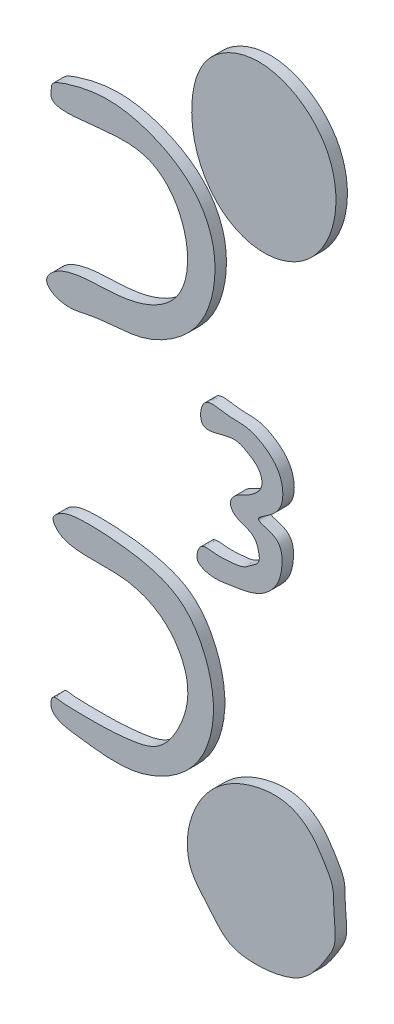
ISO-10303-21;
HEADER;
FILE_DESCRIPTION(('STEP AP214'),'2;1');
FILE_NAME('part.step','',(''),(''),'','','');
FILE_SCHEMA(('AUTOMOTIVE_DESIGN { 1 0 10303 214 1 1 1 1 }'));
ENDSEC;
DATA;
#1=APPLICATION_CONTEXT('core data for automotive mechanical design processes');
#2=APPLICATION_PROTOCOL_DEFINITION('international standard','automotive_design',2000,#1);
#3=PRODUCT_CONTEXT('',#1,'mechanical');
#4=PRODUCT('Part','Part','',(#3));
#5=PRODUCT_RELATED_PRODUCT_CATEGORY('part','',(#4));
#6=PRODUCT_DEFINITION_FORMATION('','',#4);
#7=PRODUCT_DEFINITION_CONTEXT('part definition',#1,'design');
#8=PRODUCT_DEFINITION('design','',#6,#7);
#9=PRODUCT_DEFINITION_SHAPE('','',#8);
#10=(LENGTH_UNIT() NAMED_UNIT(*) SI_UNIT(.MILLI.,.METRE.));
#11=(NAMED_UNIT(*) PLANE_ANGLE_UNIT() SI_UNIT($,.RADIAN.));
#12=(NAMED_UNIT(*) SI_UNIT($,.STERADIAN.) SOLID_ANGLE_UNIT());
#13=UNCERTAINTY_MEASURE_WITH_UNIT(LENGTH_MEASURE(1.E-05),#10,'distance_accuracy_value','');
#14=(GEOMETRIC_REPRESENTATION_CONTEXT(3) GLOBAL_UNCERTAINTY_ASSIGNED_CONTEXT((#13)) GLOBAL_UNIT_ASSIGNED_CONTEXT((#10,
#11,#12)) REPRESENTATION_CONTEXT('',''));
#15=CARTESIAN_POINT('',(0.,0.,0.));
#16=DIRECTION('',(0.,0.,1.));
#17=DIRECTION('',(1.,0.,0.));
#18=AXIS2_PLACEMENT_3D('',#15,#16,#17);
#19=CARTESIAN_POINT('',(19.1769095175235,41.8130524010244,1.));
#20=CARTESIAN_POINT('',(19.2127293099611,40.8569370075556,1.));
#21=CARTESIAN_POINT('',(22.9391668824102,40.3253882999703,1.));
#22=CARTESIAN_POINT('',(26.7960870005365,39.8912296337581,1.));
#23=CARTESIAN_POINT('',(31.8201274193938,42.6417002270307,1.));
#24=CARTESIAN_POINT('',(33.7674521936839,47.4671349221354,1.));
#25=CARTESIAN_POINT('',(33.0573206762153,51.9512628960219,1.));
#26=CARTESIAN_POINT('',(30.8975771726644,55.3873195861583,1.));
#27=CARTESIAN_POINT('',(27.7768353191343,56.5987271271401,1.));
#28=CARTESIAN_POINT('',(24.7434467814199,56.9975903585193,1.));
#29=CARTESIAN_POINT('',(22.0843075134888,57.1421200396971,1.));
#30=CARTESIAN_POINT('',(20.2334006534844,56.8869912968765,1.));
#31=CARTESIAN_POINT('',(19.1160393716033,55.9998270554432,1.));
#32=CARTESIAN_POINT('',(19.9421981153811,54.8912622026373,1.));
#33=CARTESIAN_POINT('',(22.2822562547745,54.3367217182556,1.));
#34=CARTESIAN_POINT('',(25.5262395924073,54.8588420143919,1.));
#35=CARTESIAN_POINT('',(29.5626524668037,53.2138652685741,1.));
#36=CARTESIAN_POINT('',(31.6671951302462,49.4037773602156,1.));
#37=CARTESIAN_POINT('',(30.5951850533586,45.6425908795845,1.));
#38=CARTESIAN_POINT('',(28.6732962749319,42.9231600393107,1.));
#39=CARTESIAN_POINT('',(25.9895298358259,42.4952098080403,1.));
#40=CARTESIAN_POINT('',(23.6576357502348,42.3234532963668,1.));
#41=CARTESIAN_POINT('',(21.6213926686841,42.3660759982251,1.));
#42=CARTESIAN_POINT('',(20.256089471129,42.3662155045628,1.));
#43=CARTESIAN_POINT('',(19.2856305753305,42.5704574515814,1.));
#44=CARTESIAN_POINT('',(19.1677288548537,42.058106107465,1.));
#45=CARTESIAN_POINT('',(19.1769095175235,41.8130524010244,1.));
#46=B_SPLINE_CURVE_WITH_KNOTS('',3,(#19,#20,#21,#22,#23,#24,#25,#26,#27,#28,#29,#30,#31,#32,#33,
#34,#35,#36,#37,#38,#39,#40,#41,#42,#43,#44,#45),.UNSPECIFIED.,.T.,.F.,(4,1,1,1,1,1,1,1,1,1,1,1,
1,1,1,1,1,1,1,1,1,1,1,1,4),(0.,0.0379150592425771,0.116364605725757,0.191879078514233,
0.257961728776476,0.328198116829364,0.380612999113154,0.423842653477016,0.466527075913447,
0.513302110662933,0.535834386910865,0.549988433896389,0.561702406529163,0.584495662943847,
0.65224281969705,0.698938885261616,0.764048431600336,0.817034822500031,0.860958258400186,
0.897879696286255,0.927796821476488,0.963173580580085,0.983206965710434,0.990282317531154,1.),.UNSPECIFIED.);
#47=DIRECTION('',(0.,0.,-1.));
#48=VECTOR('',#47,1.);
#49=SURFACE_OF_LINEAR_EXTRUSION('',#46,#48);
#50=CARTESIAN_POINT('',(19.1769095175235,41.8130524010244,1.));
#51=VERTEX_POINT('',#50);
#52=EDGE_CURVE('E52',#51,#51,#46,.T.);
#53=ORIENTED_EDGE('',*,*,#52,.F.);
#54=EDGE_LOOP('',(#53));
#55=FACE_BOUND('',#54,.T.);
#56=CARTESIAN_POINT('',(19.1769095175235,41.8130524010244,0.));
#57=CARTESIAN_POINT('',(19.2127293099611,40.8569370075556,0.));
#58=CARTESIAN_POINT('',(22.9391668824102,40.3253882999703,0.));
#59=CARTESIAN_POINT('',(26.7960870005365,39.8912296337581,0.));
#60=CARTESIAN_POINT('',(31.8201274193938,42.6417002270307,0.));
#61=CARTESIAN_POINT('',(33.7674521936839,47.4671349221354,0.));
#62=CARTESIAN_POINT('',(33.0573206762153,51.9512628960219,0.));
#63=CARTESIAN_POINT('',(30.8975771726644,55.3873195861583,0.));
#64=CARTESIAN_POINT('',(27.7768353191343,56.5987271271401,0.));
#65=CARTESIAN_POINT('',(24.7434467814199,56.9975903585193,0.));
#66=CARTESIAN_POINT('',(22.0843075134888,57.1421200396971,0.));
#67=CARTESIAN_POINT('',(20.2334006534844,56.8869912968765,0.));
#68=CARTESIAN_POINT('',(19.1160393716033,55.9998270554432,0.));
#69=CARTESIAN_POINT('',(19.9421981153811,54.8912622026373,0.));
#70=CARTESIAN_POINT('',(22.2822562547745,54.3367217182556,0.));
#71=CARTESIAN_POINT('',(25.5262395924073,54.8588420143919,0.));
#72=CARTESIAN_POINT('',(29.5626524668037,53.2138652685741,0.));
#73=CARTESIAN_POINT('',(31.6671951302462,49.4037773602156,0.));
#74=CARTESIAN_POINT('',(30.5951850533586,45.6425908795845,0.));
#75=CARTESIAN_POINT('',(28.6732962749319,42.9231600393107,0.));
#76=CARTESIAN_POINT('',(25.9895298358259,42.4952098080403,0.));
#77=CARTESIAN_POINT('',(23.6576357502348,42.3234532963668,0.));
#78=CARTESIAN_POINT('',(21.6213926686841,42.3660759982251,0.));
#79=CARTESIAN_POINT('',(20.256089471129,42.3662155045628,0.));
#80=CARTESIAN_POINT('',(19.2856305753305,42.5704574515814,0.));
#81=CARTESIAN_POINT('',(19.1677288548537,42.058106107465,0.));
#82=CARTESIAN_POINT('',(19.1769095175235,41.8130524010244,0.));
#83=B_SPLINE_CURVE_WITH_KNOTS('',3,(#56,#57,#58,#59,#60,#61,#62,#63,#64,#65,#66,#67,#68,#69,#70,
#71,#72,#73,#74,#75,#76,#77,#78,#79,#80,#81,#82),.UNSPECIFIED.,.T.,.F.,(4,1,1,1,1,1,1,1,1,1,1,1,
1,1,1,1,1,1,1,1,1,1,1,1,4),(0.,0.0379150592425771,0.116364605725757,0.191879078514233,
0.257961728776476,0.328198116829364,0.380612999113154,0.423842653477016,0.466527075913447,
0.513302110662933,0.535834386910865,0.549988433896389,0.561702406529163,0.584495662943847,
0.65224281969705,0.698938885261616,0.764048431600336,0.817034822500031,0.860958258400186,
0.897879696286255,0.927796821476488,0.963173580580085,0.983206965710434,0.990282317531154,1.),.UNSPECIFIED.);
#84=CARTESIAN_POINT('',(19.1769095175235,41.8130524010244,0.));
#85=VERTEX_POINT('',#84);
#86=EDGE_CURVE('E11',#85,#85,#83,.T.);
#87=ORIENTED_EDGE('',*,*,#86,.T.);
#88=EDGE_LOOP('',(#87));
#89=FACE_BOUND('',#88,.T.);
#90=ADVANCED_FACE('F48',(#55,#89),#49,.F.);
#91=CARTESIAN_POINT('',(22.4738589016224,57.0706466504918,1.));
#92=DIRECTION('',(0.,0.,1.));
#93=DIRECTION('',(1.,0.,0.));
#94=AXIS2_PLACEMENT_3D('',#91,#92,#93);
#95=PLANE('',#94);
#96=ORIENTED_EDGE('',*,*,#52,.T.);
#97=EDGE_LOOP('',(#96));
#98=FACE_BOUND('',#97,.T.);
#99=ADVANCED_FACE('F50',(#98),#95,.T.);
#100=CARTESIAN_POINT('',(22.4738589016224,57.0706466504918,0.));
#101=DIRECTION('',(0.,0.,1.));
#102=DIRECTION('',(1.,0.,0.));
#103=AXIS2_PLACEMENT_3D('',#100,#101,#102);
#104=PLANE('',#103);
#105=ORIENTED_EDGE('',*,*,#86,.F.);
#106=EDGE_LOOP('',(#105));
#107=FACE_BOUND('',#106,.T.);
#108=ADVANCED_FACE('F75',(#107),#104,.F.);
#109=CLOSED_SHELL('',(#90,#99,#108));
#110=MANIFOLD_SOLID_BREP('B2',#109);
#111=CARTESIAN_POINT('',(19.3699839763334,74.5843333177561,1.));
#112=CARTESIAN_POINT('',(17.95751609086,73.4264742509748,1.));
#113=CARTESIAN_POINT('',(20.0967074933525,72.356545750895,1.));
#114=CARTESIAN_POINT('',(24.4787871247065,73.3969297988716,1.));
#115=CARTESIAN_POINT('',(26.890213090879,72.8743985041118,1.));
#116=CARTESIAN_POINT('',(32.1758872125133,76.1161849639173,1.));
#117=CARTESIAN_POINT('',(33.6457520126305,80.2347223702887,1.));
#118=CARTESIAN_POINT('',(33.4694686280517,83.8892716546297,1.));
#119=CARTESIAN_POINT('',(32.0923561761736,86.870976380007,1.));
#120=CARTESIAN_POINT('',(29.1823065026506,88.9616013113339,1.));
#121=CARTESIAN_POINT('',(25.238794367136,90.2349043280899,1.));
#122=CARTESIAN_POINT('',(22.0943249455349,89.9902597481936,1.));
#123=CARTESIAN_POINT('',(19.3062694248186,89.0076199537967,1.));
#124=CARTESIAN_POINT('',(19.2204008009624,88.6304471944165,1.));
#125=CARTESIAN_POINT('',(19.037769788265,86.5190711637222,1.));
#126=CARTESIAN_POINT('',(25.8538652589614,88.4090960824598,1.));
#127=CARTESIAN_POINT('',(29.9267813892427,86.3050002823733,1.));
#128=CARTESIAN_POINT('',(31.5917144842774,81.9796519903294,1.));
#129=CARTESIAN_POINT('',(30.5255322575986,77.8178643402538,1.));
#130=CARTESIAN_POINT('',(27.410541455733,75.9274619920266,1.));
#131=CARTESIAN_POINT('',(24.474992879234,75.564436877282,1.));
#132=CARTESIAN_POINT('',(22.0752454678346,75.5677096955069,1.));
#133=CARTESIAN_POINT('',(20.1984641255968,75.1709838769626,1.));
#134=CARTESIAN_POINT('',(19.5455388943721,74.7282430346847,1.));
#135=CARTESIAN_POINT('',(19.3699839763334,74.5843333177561,1.));
#136=B_SPLINE_CURVE_WITH_KNOTS('',3,(#111,#112,#113,#114,#115,#116,#117,#118,#119,#120,#121,
#122,#123,#124,#125,#126,#127,#128,#129,#130,#131,#132,#133,#134,#135),.UNSPECIFIED.,.T.,.F.,(4,
1,1,1,1,1,1,1,1,1,1,1,1,1,1,1,1,1,1,1,1,1,4),(0.,0.0511609972701097,0.0712481141104165,
0.200871168403069,0.290981655404589,0.397364809002482,0.449977905586936,0.508428182977688,
0.587883311182083,0.658420526641804,0.750359903978945,0.789041815891881,0.804146679377652,
0.810012942663381,0.847704448749165,0.870956917450994,0.902310155581241,0.925727826294262,
0.946896190518269,0.966914106173136,0.981222375318625,0.993641225563492,0.999999999999999),.UNSPECIFIED.);
#137=DIRECTION('',(0.,0.,-1.));
#138=VECTOR('',#137,1.);
#139=SURFACE_OF_LINEAR_EXTRUSION('',#136,#138);
#140=CARTESIAN_POINT('',(19.3699839763334,74.5843333177561,1.));
#141=VERTEX_POINT('',#140);
#142=EDGE_CURVE('E112',#141,#141,#136,.T.);
#143=ORIENTED_EDGE('',*,*,#142,.F.);
#144=EDGE_LOOP('',(#143));
#145=FACE_BOUND('',#144,.T.);
#146=CARTESIAN_POINT('',(19.3699839763334,74.5843333177561,0.));
#147=CARTESIAN_POINT('',(17.95751609086,73.4264742509748,0.));
#148=CARTESIAN_POINT('',(20.0967074933525,72.356545750895,0.));
#149=CARTESIAN_POINT('',(24.4787871247065,73.3969297988716,0.));
#150=CARTESIAN_POINT('',(26.890213090879,72.8743985041118,0.));
#151=CARTESIAN_POINT('',(32.1758872125133,76.1161849639173,0.));
#152=CARTESIAN_POINT('',(33.6457520126305,80.2347223702887,0.));
#153=CARTESIAN_POINT('',(33.4694686280517,83.8892716546297,0.));
#154=CARTESIAN_POINT('',(32.0923561761736,86.870976380007,0.));
#155=CARTESIAN_POINT('',(29.1823065026506,88.9616013113339,0.));
#156=CARTESIAN_POINT('',(25.238794367136,90.2349043280899,0.));
#157=CARTESIAN_POINT('',(22.0943249455349,89.9902597481936,0.));
#158=CARTESIAN_POINT('',(19.3062694248186,89.0076199537967,0.));
#159=CARTESIAN_POINT('',(19.2204008009624,88.6304471944165,0.));
#160=CARTESIAN_POINT('',(19.037769788265,86.5190711637222,0.));
#161=CARTESIAN_POINT('',(25.8538652589614,88.4090960824598,0.));
#162=CARTESIAN_POINT('',(29.9267813892427,86.3050002823733,0.));
#163=CARTESIAN_POINT('',(31.5917144842774,81.9796519903294,0.));
#164=CARTESIAN_POINT('',(30.5255322575986,77.8178643402538,0.));
#165=CARTESIAN_POINT('',(27.410541455733,75.9274619920266,0.));
#166=CARTESIAN_POINT('',(24.474992879234,75.564436877282,0.));
#167=CARTESIAN_POINT('',(22.0752454678346,75.5677096955069,0.));
#168=CARTESIAN_POINT('',(20.1984641255968,75.1709838769626,0.));
#169=CARTESIAN_POINT('',(19.5455388943721,74.7282430346847,0.));
#170=CARTESIAN_POINT('',(19.3699839763334,74.5843333177561,0.));
#171=B_SPLINE_CURVE_WITH_KNOTS('',3,(#146,#147,#148,#149,#150,#151,#152,#153,#154,#155,#156,
#157,#158,#159,#160,#161,#162,#163,#164,#165,#166,#167,#168,#169,#170),.UNSPECIFIED.,.T.,.F.,(4,
1,1,1,1,1,1,1,1,1,1,1,1,1,1,1,1,1,1,1,1,1,4),(0.,0.0511609972701097,0.0712481141104165,
0.200871168403069,0.290981655404589,0.397364809002482,0.449977905586936,0.508428182977688,
0.587883311182083,0.658420526641804,0.750359903978945,0.789041815891881,0.804146679377652,
0.810012942663381,0.847704448749165,0.870956917450994,0.902310155581241,0.925727826294262,
0.946896190518269,0.966914106173136,0.981222375318625,0.993641225563492,0.999999999999999),.UNSPECIFIED.);
#172=CARTESIAN_POINT('',(19.3699839763334,74.5843333177561,0.));
#173=VERTEX_POINT('',#172);
#174=EDGE_CURVE('E47',#173,#173,#171,.T.);
#175=ORIENTED_EDGE('',*,*,#174,.T.);
#176=EDGE_LOOP('',(#175));
#177=FACE_BOUND('',#176,.T.);
#178=ADVANCED_FACE('F108',(#145,#177),#139,.F.);
#179=CARTESIAN_POINT('',(32.3218093787542,86.0591395181149,1.));
#180=DIRECTION('',(0.,0.,1.));
#181=DIRECTION('',(1.,0.,0.));
#182=AXIS2_PLACEMENT_3D('',#179,#180,#181);
#183=PLANE('',#182);
#184=ORIENTED_EDGE('',*,*,#142,.T.);
#185=EDGE_LOOP('',(#184));
#186=FACE_BOUND('',#185,.T.);
#187=ADVANCED_FACE('F110',(#186),#183,.T.);
#188=CARTESIAN_POINT('',(32.3218093787542,86.0591395181149,0.));
#189=DIRECTION('',(0.,0.,1.));
#190=DIRECTION('',(1.,0.,0.));
#191=AXIS2_PLACEMENT_3D('',#188,#189,#190);
#192=PLANE('',#191);
#193=ORIENTED_EDGE('',*,*,#174,.F.);
#194=EDGE_LOOP('',(#193));
#195=FACE_BOUND('',#194,.T.);
#196=ADVANCED_FACE('F135',(#195),#192,.F.);
#197=CLOSED_SHELL('',(#178,#187,#196));
#198=MANIFOLD_SOLID_BREP('B6',#197);
#199=CARTESIAN_POINT('',(32.0773903916401,58.9557931552585,1.));
#200=CARTESIAN_POINT('',(32.1422665617339,58.8790108035937,1.));
#201=CARTESIAN_POINT('',(33.0431758167882,58.30808060051,1.));
#202=CARTESIAN_POINT('',(35.0524639418102,58.6733322109347,1.));
#203=CARTESIAN_POINT('',(37.4986422254809,59.0303686515241,1.));
#204=CARTESIAN_POINT('',(39.0448827900589,60.6182402224946,1.));
#205=CARTESIAN_POINT('',(39.4580122584865,62.4036936427596,1.));
#206=CARTESIAN_POINT('',(39.3775342642247,64.4208823138532,1.));
#207=CARTESIAN_POINT('',(36.6531187458659,64.699459583757,1.));
#208=CARTESIAN_POINT('',(38.6302707217951,65.7785064370466,1.));
#209=CARTESIAN_POINT('',(39.613732569741,67.0468393366543,1.));
#210=CARTESIAN_POINT('',(39.3617617645349,69.326087297689,1.));
#211=CARTESIAN_POINT('',(37.9414284448794,70.6473821946441,1.));
#212=CARTESIAN_POINT('',(36.2702597293126,71.4438201471316,1.));
#213=CARTESIAN_POINT('',(34.5883129618198,71.2478513388876,1.));
#214=CARTESIAN_POINT('',(32.3578788990359,71.9659353268513,1.));
#215=CARTESIAN_POINT('',(31.9860199626531,68.4617112690544,1.));
#216=CARTESIAN_POINT('',(34.8527257263477,70.2581769144782,1.));
#217=CARTESIAN_POINT('',(36.3920502054541,69.4215001329689,1.));
#218=CARTESIAN_POINT('',(37.4074331881072,68.8080321822208,1.));
#219=CARTESIAN_POINT('',(37.8091539931196,67.4843583899574,1.));
#220=CARTESIAN_POINT('',(37.024113345266,66.6082018900011,1.));
#221=CARTESIAN_POINT('',(36.1530480804512,66.0751811256531,1.));
#222=CARTESIAN_POINT('',(35.2839372192308,65.7475624136224,1.));
#223=CARTESIAN_POINT('',(34.738004920141,64.9543402966446,1.));
#224=CARTESIAN_POINT('',(35.1126656134381,64.1141546125998,1.));
#225=CARTESIAN_POINT('',(35.9976155233593,63.7876197202694,1.));
#226=CARTESIAN_POINT('',(37.0146251758893,63.4183035537228,1.));
#227=CARTESIAN_POINT('',(37.3384124963058,62.4873299096867,1.));
#228=CARTESIAN_POINT('',(37.4832754032298,61.5586319800523,1.));
#229=CARTESIAN_POINT('',(36.7184344778717,61.09663829995,1.));
#230=CARTESIAN_POINT('',(36.0182150470666,60.4841914007699,1.));
#231=CARTESIAN_POINT('',(34.791490446419,60.3880843565801,1.));
#232=CARTESIAN_POINT('',(33.6184519576509,60.2941156462247,1.));
#233=CARTESIAN_POINT('',(32.3509949774794,60.5680381359891,1.));
#234=CARTESIAN_POINT('',(31.9310958870498,59.7097126369179,1.));
#235=CARTESIAN_POINT('',(31.9165360220081,59.1461677836936,1.));
#236=CARTESIAN_POINT('',(32.0773903916401,58.9557931552585,1.));
#237=B_SPLINE_CURVE_WITH_KNOTS('',3,(#199,#200,#201,#202,#203,#204,#205,#206,#207,#208,#209,
#210,#211,#212,#213,#214,#215,#216,#217,#218,#219,#220,#221,#222,#223,#224,#225,#226,#227,#228,
#229,#230,#231,#232,#233,#234,#235,#236),.UNSPECIFIED.,.T.,.F.,(4,1,1,1,1,1,1,1,1,1,1,1,1,1,1,1,
1,1,1,1,1,1,1,1,1,1,1,1,1,1,1,1,1,1,1,4),(0.,0.00644547680776586,0.0629022022130515,
0.116764070221339,0.158609127270666,0.188532294287894,0.23203675419118,0.263211897908816,
0.287465224319861,0.325710351843378,0.370480117540325,0.410379970555661,0.442417716577108,
0.480125012665552,0.51960888586507,0.553855167644431,0.614935918690318,0.636568933662647,
0.662430228439758,0.686543783155077,0.71021492203405,0.728153902568175,0.750338930094305,
0.767419714185549,0.779895976860108,0.80105715649665,0.824043074902373,0.842150432401872,
0.860036573408748,0.875127482526761,0.892202439811565,0.917880590769265,0.946364990952901,
0.970252834175059,0.984019045708294,1.),.UNSPECIFIED.);
#238=DIRECTION('',(0.,0.,-1.));
#239=VECTOR('',#238,1.);
#240=SURFACE_OF_LINEAR_EXTRUSION('',#237,#239);
#241=CARTESIAN_POINT('',(32.0773903916401,58.9557931552585,1.));
#242=VERTEX_POINT('',#241);
#243=EDGE_CURVE('E172',#242,#242,#237,.T.);
#244=ORIENTED_EDGE('',*,*,#243,.F.);
#245=EDGE_LOOP('',(#244));
#246=FACE_BOUND('',#245,.T.);
#247=CARTESIAN_POINT('',(32.0773903916401,58.9557931552585,0.));
#248=CARTESIAN_POINT('',(32.1422665617339,58.8790108035937,0.));
#249=CARTESIAN_POINT('',(33.0431758167882,58.30808060051,0.));
#250=CARTESIAN_POINT('',(35.0524639418102,58.6733322109347,0.));
#251=CARTESIAN_POINT('',(37.4986422254809,59.0303686515241,0.));
#252=CARTESIAN_POINT('',(39.0448827900589,60.6182402224946,0.));
#253=CARTESIAN_POINT('',(39.4580122584865,62.4036936427596,0.));
#254=CARTESIAN_POINT('',(39.3775342642247,64.4208823138532,0.));
#255=CARTESIAN_POINT('',(36.6531187458659,64.699459583757,0.));
#256=CARTESIAN_POINT('',(38.6302707217951,65.7785064370466,0.));
#257=CARTESIAN_POINT('',(39.613732569741,67.0468393366543,0.));
#258=CARTESIAN_POINT('',(39.3617617645349,69.326087297689,0.));
#259=CARTESIAN_POINT('',(37.9414284448794,70.6473821946441,0.));
#260=CARTESIAN_POINT('',(36.2702597293126,71.4438201471316,0.));
#261=CARTESIAN_POINT('',(34.5883129618198,71.2478513388876,0.));
#262=CARTESIAN_POINT('',(32.3578788990359,71.9659353268513,0.));
#263=CARTESIAN_POINT('',(31.9860199626531,68.4617112690544,0.));
#264=CARTESIAN_POINT('',(34.8527257263477,70.2581769144782,0.));
#265=CARTESIAN_POINT('',(36.3920502054541,69.4215001329689,0.));
#266=CARTESIAN_POINT('',(37.4074331881072,68.8080321822208,0.));
#267=CARTESIAN_POINT('',(37.8091539931196,67.4843583899574,0.));
#268=CARTESIAN_POINT('',(37.024113345266,66.6082018900011,0.));
#269=CARTESIAN_POINT('',(36.1530480804512,66.0751811256531,0.));
#270=CARTESIAN_POINT('',(35.2839372192308,65.7475624136224,0.));
#271=CARTESIAN_POINT('',(34.738004920141,64.9543402966446,0.));
#272=CARTESIAN_POINT('',(35.1126656134381,64.1141546125998,0.));
#273=CARTESIAN_POINT('',(35.9976155233593,63.7876197202694,0.));
#274=CARTESIAN_POINT('',(37.0146251758893,63.4183035537228,0.));
#275=CARTESIAN_POINT('',(37.3384124963058,62.4873299096867,0.));
#276=CARTESIAN_POINT('',(37.4832754032298,61.5586319800523,0.));
#277=CARTESIAN_POINT('',(36.7184344778717,61.09663829995,0.));
#278=CARTESIAN_POINT('',(36.0182150470666,60.4841914007699,0.));
#279=CARTESIAN_POINT('',(34.791490446419,60.3880843565801,0.));
#280=CARTESIAN_POINT('',(33.6184519576509,60.2941156462247,0.));
#281=CARTESIAN_POINT('',(32.3509949774794,60.5680381359891,0.));
#282=CARTESIAN_POINT('',(31.9310958870498,59.7097126369179,0.));
#283=CARTESIAN_POINT('',(31.9165360220081,59.1461677836936,0.));
#284=CARTESIAN_POINT('',(32.0773903916401,58.9557931552585,0.));
#285=B_SPLINE_CURVE_WITH_KNOTS('',3,(#247,#248,#249,#250,#251,#252,#253,#254,#255,#256,#257,
#258,#259,#260,#261,#262,#263,#264,#265,#266,#267,#268,#269,#270,#271,#272,#273,#274,#275,#276,
#277,#278,#279,#280,#281,#282,#283,#284),.UNSPECIFIED.,.T.,.F.,(4,1,1,1,1,1,1,1,1,1,1,1,1,1,1,1,
1,1,1,1,1,1,1,1,1,1,1,1,1,1,1,1,1,1,1,4),(0.,0.00644547680776586,0.0629022022130515,
0.116764070221339,0.158609127270666,0.188532294287894,0.23203675419118,0.263211897908816,
0.287465224319861,0.325710351843378,0.370480117540325,0.410379970555661,0.442417716577108,
0.480125012665552,0.51960888586507,0.553855167644431,0.614935918690318,0.636568933662647,
0.662430228439758,0.686543783155077,0.71021492203405,0.728153902568175,0.750338930094305,
0.767419714185549,0.779895976860108,0.80105715649665,0.824043074902373,0.842150432401872,
0.860036573408748,0.875127482526761,0.892202439811565,0.917880590769265,0.946364990952901,
0.970252834175059,0.984019045708294,1.),.UNSPECIFIED.);
#286=CARTESIAN_POINT('',(32.0773903916401,58.9557931552585,0.));
#287=VERTEX_POINT('',#286);
#288=EDGE_CURVE('E107',#287,#287,#285,.T.);
#289=ORIENTED_EDGE('',*,*,#288,.T.);
#290=EDGE_LOOP('',(#289));
#291=FACE_BOUND('',#290,.T.);
#292=ADVANCED_FACE('F168',(#246,#291),#240,.F.);
#293=CARTESIAN_POINT('',(33.4655881712044,71.553517107237,1.));
#294=DIRECTION('',(0.,0.,1.));
#295=DIRECTION('',(1.,0.,0.));
#296=AXIS2_PLACEMENT_3D('',#293,#294,#295);
#297=PLANE('',#296);
#298=ORIENTED_EDGE('',*,*,#243,.T.);
#299=EDGE_LOOP('',(#298));
#300=FACE_BOUND('',#299,.T.);
#301=ADVANCED_FACE('F170',(#300),#297,.T.);
#302=CARTESIAN_POINT('',(33.4655881712044,71.553517107237,0.));
#303=DIRECTION('',(0.,0.,1.));
#304=DIRECTION('',(1.,0.,0.));
#305=AXIS2_PLACEMENT_3D('',#302,#303,#304);
#306=PLANE('',#305);
#307=ORIENTED_EDGE('',*,*,#288,.F.);
#308=EDGE_LOOP('',(#307));
#309=FACE_BOUND('',#308,.T.);
#310=ADVANCED_FACE('F195',(#309),#306,.F.);
#311=CLOSED_SHELL('',(#292,#301,#310));
#312=MANIFOLD_SOLID_BREP('B42',#311);
#313=CARTESIAN_POINT('',(31.4861990816156,92.6970606715284,1.));
#314=CARTESIAN_POINT('',(31.5031680679526,91.6104379709167,1.));
#315=CARTESIAN_POINT('',(31.9072934652433,89.3566550133921,1.));
#316=CARTESIAN_POINT('',(33.8805412029424,86.3625292223017,1.));
#317=CARTESIAN_POINT('',(37.3835747144362,84.8701729176114,1.));
#318=CARTESIAN_POINT('',(41.5831227144191,85.9325003450324,1.));
#319=CARTESIAN_POINT('',(44.5304495458367,90.3879576331383,1.));
#320=CARTESIAN_POINT('',(43.9096386706214,96.8860947631901,1.));
#321=CARTESIAN_POINT('',(37.9571283303139,100.508618986933,1.));
#322=CARTESIAN_POINT('',(32.2440696747111,97.9615518282329,1.));
#323=CARTESIAN_POINT('',(31.4592888933558,94.4202762402262,1.));
#324=CARTESIAN_POINT('',(31.4861990816156,92.6970606715284,1.));
#325=B_SPLINE_CURVE_WITH_KNOTS('',3,(#313,#314,#315,#316,#317,#318,#319,#320,#321,#322,#323,
#324),.UNSPECIFIED.,.T.,.F.,(4,1,1,1,1,1,1,1,1,4),(0.,0.0769547830289696,0.165433038096897,
0.24724660073086,0.336953252685373,0.45600480093758,0.603420703523289,0.762458454605298,
0.877961614342647,1.),.UNSPECIFIED.);
#326=DIRECTION('',(0.,0.,-1.));
#327=VECTOR('',#326,1.);
#328=SURFACE_OF_LINEAR_EXTRUSION('',#325,#327);
#329=CARTESIAN_POINT('',(31.4861990816156,92.6970606715284,1.));
#330=VERTEX_POINT('',#329);
#331=EDGE_CURVE('E231',#330,#330,#325,.T.);
#332=ORIENTED_EDGE('',*,*,#331,.F.);
#333=EDGE_LOOP('',(#332));
#334=FACE_BOUND('',#333,.T.);
#335=CARTESIAN_POINT('',(31.4861990816156,92.6970606715284,0.));
#336=CARTESIAN_POINT('',(31.5031680679526,91.6104379709167,0.));
#337=CARTESIAN_POINT('',(31.9072934652433,89.3566550133921,0.));
#338=CARTESIAN_POINT('',(33.8805412029424,86.3625292223017,0.));
#339=CARTESIAN_POINT('',(37.3835747144362,84.8701729176114,0.));
#340=CARTESIAN_POINT('',(41.5831227144191,85.9325003450324,0.));
#341=CARTESIAN_POINT('',(44.5304495458367,90.3879576331383,0.));
#342=CARTESIAN_POINT('',(43.9096386706214,96.8860947631901,0.));
#343=CARTESIAN_POINT('',(37.9571283303139,100.508618986933,0.));
#344=CARTESIAN_POINT('',(32.2440696747111,97.9615518282329,0.));
#345=CARTESIAN_POINT('',(31.4592888933558,94.4202762402262,0.));
#346=CARTESIAN_POINT('',(31.4861990816156,92.6970606715284,0.));
#347=B_SPLINE_CURVE_WITH_KNOTS('',3,(#335,#336,#337,#338,#339,#340,#341,#342,#343,#344,#345,
#346),.UNSPECIFIED.,.T.,.F.,(4,1,1,1,1,1,1,1,1,4),(0.,0.0769547830289696,0.165433038096897,
0.24724660073086,0.336953252685373,0.45600480093758,0.603420703523289,0.762458454605298,
0.877961614342647,1.),.UNSPECIFIED.);
#348=CARTESIAN_POINT('',(31.4861990816156,92.6970606715284,0.));
#349=VERTEX_POINT('',#348);
#350=EDGE_CURVE('E167',#349,#349,#347,.T.);
#351=ORIENTED_EDGE('',*,*,#350,.T.);
#352=EDGE_LOOP('',(#351));
#353=FACE_BOUND('',#352,.T.);
#354=ADVANCED_FACE('F227',(#334,#353),#328,.F.);
#355=CARTESIAN_POINT('',(44.0813162812722,92.0356024206857,1.));
#356=DIRECTION('',(0.,0.,-1.));
#357=DIRECTION('',(-1.,0.,0.));
#358=AXIS2_PLACEMENT_3D('',#355,#356,#357);
#359=PLANE('',#358);
#360=ORIENTED_EDGE('',*,*,#331,.T.);
#361=EDGE_LOOP('',(#360));
#362=FACE_BOUND('',#361,.T.);
#363=ADVANCED_FACE('F229',(#362),#359,.F.);
#364=CARTESIAN_POINT('',(44.0813162812722,92.0356024206857,0.));
#365=DIRECTION('',(0.,0.,-1.));
#366=DIRECTION('',(-1.,0.,0.));
#367=AXIS2_PLACEMENT_3D('',#364,#365,#366);
#368=PLANE('',#367);
#369=ORIENTED_EDGE('',*,*,#350,.F.);
#370=EDGE_LOOP('',(#369));
#371=FACE_BOUND('',#370,.T.);
#372=ADVANCED_FACE('F254',(#371),#368,.T.);
#373=CLOSED_SHELL('',(#354,#363,#372));
#374=MANIFOLD_SOLID_BREP('B102',#373);
#375=CARTESIAN_POINT('',(31.4861990816158,35.2824844946497,1.));
#376=CARTESIAN_POINT('',(31.8279102572678,34.5600917746837,1.));
#377=CARTESIAN_POINT('',(33.0398245901858,33.3107643997827,1.));
#378=CARTESIAN_POINT('',(34.5070060878886,31.3137148570279,1.));
#379=CARTESIAN_POINT('',(37.0141642272682,30.9622940007199,1.));
#380=CARTESIAN_POINT('',(39.0658436922572,31.1857636548352,1.));
#381=CARTESIAN_POINT('',(41.0307333386012,31.8623852184661,1.));
#382=CARTESIAN_POINT('',(42.358128836399,33.1589386690436,1.));
#383=CARTESIAN_POINT('',(43.2504485471077,34.5257971400244,1.));
#384=CARTESIAN_POINT('',(44.2434195178102,36.1903600065044,1.));
#385=CARTESIAN_POINT('',(43.8020206435103,38.1647780847675,1.));
#386=CARTESIAN_POINT('',(43.9979744244769,40.2636754416022,1.));
#387=CARTESIAN_POINT('',(42.9932935982346,41.8751704743324,1.));
#388=CARTESIAN_POINT('',(41.9923771993716,43.4541815623109,1.));
#389=CARTESIAN_POINT('',(40.0092617649446,44.8047638907104,1.));
#390=CARTESIAN_POINT('',(37.0758245764919,44.6799626160497,1.));
#391=CARTESIAN_POINT('',(33.6490089135816,43.2304407577099,1.));
#392=CARTESIAN_POINT('',(31.1487087740227,39.7883559976931,1.));
#393=CARTESIAN_POINT('',(30.9106159792971,36.4992929354539,1.));
#394=CARTESIAN_POINT('',(31.4861990816158,35.2824844946497,1.));
#395=B_SPLINE_CURVE_WITH_KNOTS('',3,(#375,#376,#377,#378,#379,#380,#381,#382,#383,#384,#385,
#386,#387,#388,#389,#390,#391,#392,#393,#394),.UNSPECIFIED.,.T.,.F.,(4,1,1,1,1,1,1,1,1,1,1,1,1,
1,1,1,1,4),(0.,0.0594263200798602,0.12325521417036,0.170245142434559,0.232946115927226,
0.27347482524194,0.317628528942498,0.363604687746256,0.392959063217837,0.453674563784987,
0.50137542392631,0.541737690199736,0.58637661400445,0.637352116139983,0.706291946545099,
0.788602055053752,0.899901472037943,1.),.UNSPECIFIED.);
#396=DIRECTION('',(0.,0.,-1.));
#397=VECTOR('',#396,1.);
#398=SURFACE_OF_LINEAR_EXTRUSION('',#395,#397);
#399=CARTESIAN_POINT('',(31.4861990816158,35.2824844946497,1.));
#400=VERTEX_POINT('',#399);
#401=EDGE_CURVE('E226',#400,#400,#395,.T.);
#402=ORIENTED_EDGE('',*,*,#401,.F.);
#403=EDGE_LOOP('',(#402));
#404=FACE_BOUND('',#403,.T.);
#405=CARTESIAN_POINT('',(31.4861990816158,35.2824844946497,0.));
#406=CARTESIAN_POINT('',(31.8279102572678,34.5600917746837,0.));
#407=CARTESIAN_POINT('',(33.0398245901858,33.3107643997827,0.));
#408=CARTESIAN_POINT('',(34.5070060878886,31.3137148570279,0.));
#409=CARTESIAN_POINT('',(37.0141642272682,30.9622940007199,0.));
#410=CARTESIAN_POINT('',(39.0658436922572,31.1857636548352,0.));
#411=CARTESIAN_POINT('',(41.0307333386012,31.8623852184661,0.));
#412=CARTESIAN_POINT('',(42.358128836399,33.1589386690436,0.));
#413=CARTESIAN_POINT('',(43.2504485471077,34.5257971400244,0.));
#414=CARTESIAN_POINT('',(44.2434195178102,36.1903600065044,0.));
#415=CARTESIAN_POINT('',(43.8020206435103,38.1647780847675,0.));
#416=CARTESIAN_POINT('',(43.9979744244769,40.2636754416022,0.));
#417=CARTESIAN_POINT('',(42.9932935982346,41.8751704743324,0.));
#418=CARTESIAN_POINT('',(41.9923771993716,43.4541815623109,0.));
#419=CARTESIAN_POINT('',(40.0092617649446,44.8047638907104,0.));
#420=CARTESIAN_POINT('',(37.0758245764919,44.6799626160497,0.));
#421=CARTESIAN_POINT('',(33.6490089135816,43.2304407577099,0.));
#422=CARTESIAN_POINT('',(31.1487087740227,39.7883559976931,0.));
#423=CARTESIAN_POINT('',(30.9106159792971,36.4992929354539,0.));
#424=CARTESIAN_POINT('',(31.4861990816158,35.2824844946497,0.));
#425=B_SPLINE_CURVE_WITH_KNOTS('',3,(#405,#406,#407,#408,#409,#410,#411,#412,#413,#414,#415,
#416,#417,#418,#419,#420,#421,#422,#423,#424),.UNSPECIFIED.,.T.,.F.,(4,1,1,1,1,1,1,1,1,1,1,1,1,
1,1,1,1,4),(0.,0.0594263200798602,0.12325521417036,0.170245142434559,0.232946115927226,
0.27347482524194,0.317628528942498,0.363604687746256,0.392959063217837,0.453674563784987,
0.50137542392631,0.541737690199736,0.58637661400445,0.637352116139983,0.706291946545099,
0.788602055053752,0.899901472037943,1.),.UNSPECIFIED.);
#426=CARTESIAN_POINT('',(31.4861990816158,35.2824844946497,0.));
#427=VERTEX_POINT('',#426);
#428=EDGE_CURVE('E283',#427,#427,#425,.T.);
#429=ORIENTED_EDGE('',*,*,#428,.T.);
#430=EDGE_LOOP('',(#429));
#431=FACE_BOUND('',#430,.T.);
#432=ADVANCED_FACE('F279',(#404,#431),#398,.F.);
#433=CARTESIAN_POINT('',(43.7918568834255,40.2625162488379,1.));
#434=DIRECTION('',(0.,0.,1.));
#435=DIRECTION('',(1.,0.,0.));
#436=AXIS2_PLACEMENT_3D('',#433,#434,#435);
#437=PLANE('',#436);
#438=ORIENTED_EDGE('',*,*,#401,.T.);
#439=EDGE_LOOP('',(#438));
#440=FACE_BOUND('',#439,.T.);
#441=ADVANCED_FACE('F302',(#440),#437,.T.);
#442=CARTESIAN_POINT('',(43.7918568834255,40.2625162488379,0.));
#443=DIRECTION('',(0.,0.,1.));
#444=DIRECTION('',(1.,0.,0.));
#445=AXIS2_PLACEMENT_3D('',#442,#443,#444);
#446=PLANE('',#445);
#447=ORIENTED_EDGE('',*,*,#428,.F.);
#448=EDGE_LOOP('',(#447));
#449=FACE_BOUND('',#448,.T.);
#450=ADVANCED_FACE('F300',(#449),#446,.F.);
#451=CLOSED_SHELL('',(#432,#441,#450));
#452=MANIFOLD_SOLID_BREP('B162',#451);
#453=ADVANCED_BREP_SHAPE_REPRESENTATION('',(#18,#110,#198,#312,#374,#452),#14);
#454=SHAPE_DEFINITION_REPRESENTATION(#9,#453);
ENDSEC;
END-ISO-10303-21;
